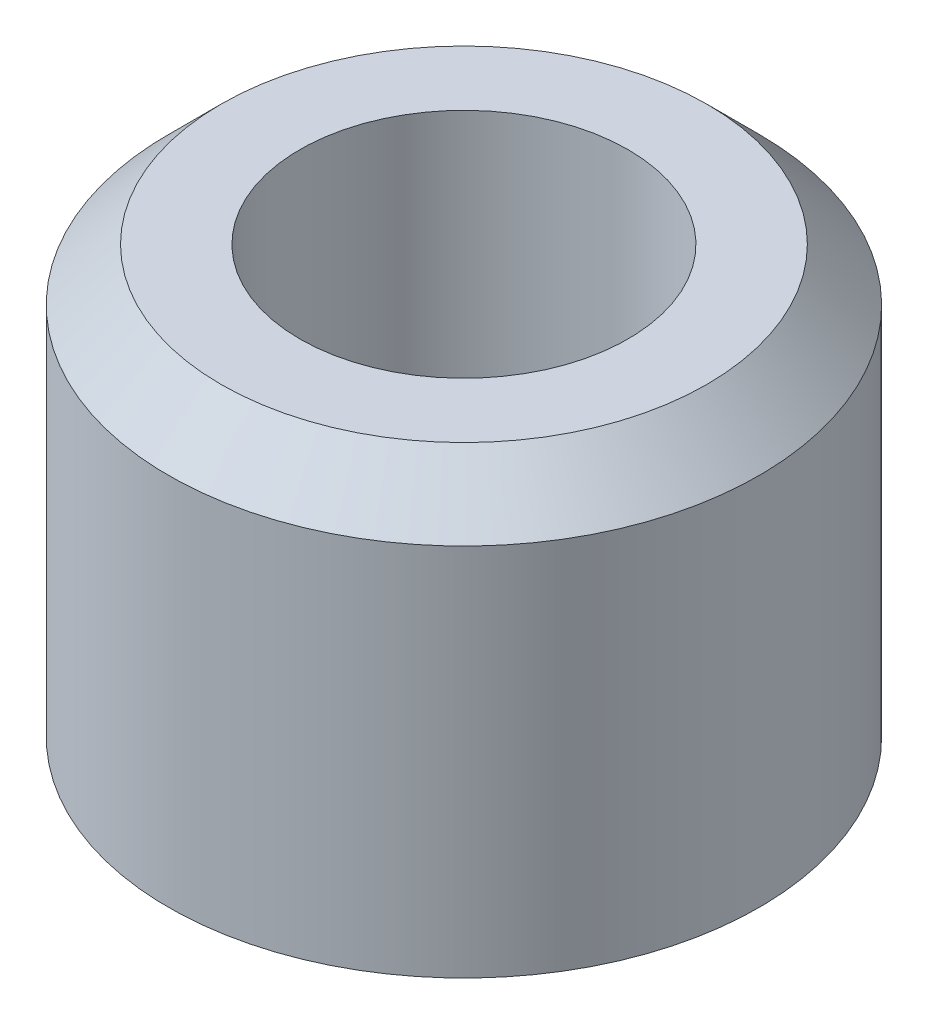
ISO-10303-21;
HEADER;
FILE_DESCRIPTION(('STEP AP214'),'2;1');
FILE_NAME('part.step','',(''),(''),'','','');
FILE_SCHEMA(('AUTOMOTIVE_DESIGN { 1 0 10303 214 1 1 1 1 }'));
ENDSEC;
DATA;
#1=APPLICATION_CONTEXT('core data for automotive mechanical design processes');
#2=APPLICATION_PROTOCOL_DEFINITION('international standard','automotive_design',2000,#1);
#3=PRODUCT_CONTEXT('',#1,'mechanical');
#4=PRODUCT('Part','Part','',(#3));
#5=PRODUCT_RELATED_PRODUCT_CATEGORY('part','',(#4));
#6=PRODUCT_DEFINITION_FORMATION('','',#4);
#7=PRODUCT_DEFINITION_CONTEXT('part definition',#1,'design');
#8=PRODUCT_DEFINITION('design','',#6,#7);
#9=PRODUCT_DEFINITION_SHAPE('','',#8);
#10=(LENGTH_UNIT() NAMED_UNIT(*) SI_UNIT(.MILLI.,.METRE.));
#11=(NAMED_UNIT(*) PLANE_ANGLE_UNIT() SI_UNIT($,.RADIAN.));
#12=(NAMED_UNIT(*) SI_UNIT($,.STERADIAN.) SOLID_ANGLE_UNIT());
#13=UNCERTAINTY_MEASURE_WITH_UNIT(LENGTH_MEASURE(1.E-05),#10,'distance_accuracy_value','');
#14=(GEOMETRIC_REPRESENTATION_CONTEXT(3) GLOBAL_UNCERTAINTY_ASSIGNED_CONTEXT((#13)) GLOBAL_UNIT_ASSIGNED_CONTEXT((#10,
#11,#12)) REPRESENTATION_CONTEXT('',''));
#15=CARTESIAN_POINT('',(0.,0.,0.));
#16=DIRECTION('',(0.,0.,1.));
#17=DIRECTION('',(1.,0.,0.));
#18=AXIS2_PLACEMENT_3D('',#15,#16,#17);
#19=CARTESIAN_POINT('',(0.,6.5,0.));
#20=DIRECTION('',(0.,1.,0.));
#21=DIRECTION('',(0.,0.,1.));
#22=AXIS2_PLACEMENT_3D('',#19,#20,#21);
#23=PLANE('',#22);
#24=CARTESIAN_POINT('',(0.,6.5,0.));
#25=DIRECTION('',(0.,1.,0.));
#26=DIRECTION('',(0.,0.,1.));
#27=AXIS2_PLACEMENT_3D('',#24,#25,#26);
#28=CIRCLE('',#27,3.70000000000001);
#29=CARTESIAN_POINT('',(0.,6.5,3.70000000000001));
#30=VERTEX_POINT('',#29);
#31=EDGE_CURVE('E40',#30,#30,#28,.T.);
#32=ORIENTED_EDGE('',*,*,#31,.T.);
#33=EDGE_LOOP('',(#32));
#34=FACE_BOUND('',#33,.T.);
#35=CARTESIAN_POINT('',(0.,6.5,0.));
#36=DIRECTION('',(0.,1.,0.));
#37=DIRECTION('',(0.,0.,1.));
#38=AXIS2_PLACEMENT_3D('',#35,#36,#37);
#39=CIRCLE('',#38,2.5);
#40=CARTESIAN_POINT('',(0.,6.5,-2.5));
#41=VERTEX_POINT('',#40);
#42=EDGE_CURVE('E48',#41,#41,#39,.T.);
#43=ORIENTED_EDGE('',*,*,#42,.F.);
#44=EDGE_LOOP('',(#43));
#45=FACE_BOUND('',#44,.T.);
#46=ADVANCED_FACE('F33',(#34,#45),#23,.T.);
#47=CARTESIAN_POINT('',(0.,0.,0.));
#48=DIRECTION('',(0.,1.,0.));
#49=DIRECTION('',(0.,0.,1.));
#50=AXIS2_PLACEMENT_3D('',#47,#48,#49);
#51=PLANE('',#50);
#52=CARTESIAN_POINT('',(0.,0.,0.));
#53=DIRECTION('',(0.,1.,0.));
#54=DIRECTION('',(0.,0.,1.));
#55=AXIS2_PLACEMENT_3D('',#52,#53,#54);
#56=CIRCLE('',#55,4.5);
#57=CARTESIAN_POINT('',(0.,0.,-4.5));
#58=VERTEX_POINT('',#57);
#59=EDGE_CURVE('E44',#58,#58,#56,.T.);
#60=ORIENTED_EDGE('',*,*,#59,.F.);
#61=EDGE_LOOP('',(#60));
#62=FACE_BOUND('',#61,.T.);
#63=CARTESIAN_POINT('',(0.,0.,0.));
#64=DIRECTION('',(0.,1.,0.));
#65=DIRECTION('',(0.,0.,1.));
#66=AXIS2_PLACEMENT_3D('',#63,#64,#65);
#67=CIRCLE('',#66,2.5);
#68=CARTESIAN_POINT('',(0.,0.,-2.5));
#69=VERTEX_POINT('',#68);
#70=EDGE_CURVE('E51',#69,#69,#67,.T.);
#71=ORIENTED_EDGE('',*,*,#70,.T.);
#72=EDGE_LOOP('',(#71));
#73=FACE_BOUND('',#72,.T.);
#74=ADVANCED_FACE('F61',(#62,#73),#51,.F.);
#75=CARTESIAN_POINT('',(0.,6.5,0.));
#76=DIRECTION('',(0.,-1.,0.));
#77=DIRECTION('',(0.,0.,-1.));
#78=AXIS2_PLACEMENT_3D('',#75,#76,#77);
#79=CYLINDRICAL_SURFACE('',#78,4.5);
#80=CARTESIAN_POINT('',(0.,5.70000000000001,0.));
#81=DIRECTION('',(0.,1.,0.));
#82=DIRECTION('',(0.,0.,1.));
#83=AXIS2_PLACEMENT_3D('',#80,#81,#82);
#84=CIRCLE('',#83,4.5);
#85=CARTESIAN_POINT('',(0.,5.70000000000001,-4.5));
#86=VERTEX_POINT('',#85);
#87=EDGE_CURVE('E10',#86,#86,#84,.F.);
#88=CARTESIAN_POINT('',(0.,5.70000000000001,-4.5));
#89=CARTESIAN_POINT('',(0.,5.64062500000001,-4.5));
#90=CARTESIAN_POINT('',(0.,5.58125000000001,-4.5));
#91=CARTESIAN_POINT('',(0.,5.46250000000001,-4.5));
#92=CARTESIAN_POINT('',(0.,5.40312500000001,-4.5));
#93=CARTESIAN_POINT('',(0.,5.28437500000001,-4.5));
#94=CARTESIAN_POINT('',(0.,5.22500000000001,-4.5));
#95=CARTESIAN_POINT('',(0.,5.10625000000001,-4.5));
#96=CARTESIAN_POINT('',(0.,5.04687500000001,-4.5));
#97=CARTESIAN_POINT('',(0.,4.928125,-4.5));
#98=CARTESIAN_POINT('',(0.,4.86875000000001,-4.5));
#99=CARTESIAN_POINT('',(0.,4.75000000000001,-4.5));
#100=CARTESIAN_POINT('',(0.,4.69062500000001,-4.5));
#101=CARTESIAN_POINT('',(0.,4.57187500000001,-4.5));
#102=CARTESIAN_POINT('',(0.,4.51250000000001,-4.5));
#103=CARTESIAN_POINT('',(0.,4.39375000000001,-4.5));
#104=CARTESIAN_POINT('',(0.,4.334375,-4.5));
#105=CARTESIAN_POINT('',(0.,4.215625,-4.5));
#106=CARTESIAN_POINT('',(0.,4.15625,-4.5));
#107=CARTESIAN_POINT('',(0.,4.0375,-4.5));
#108=CARTESIAN_POINT('',(0.,3.97812500000001,-4.5));
#109=CARTESIAN_POINT('',(0.,3.859375,-4.5));
#110=CARTESIAN_POINT('',(0.,3.8,-4.5));
#111=CARTESIAN_POINT('',(0.,3.68125,-4.5));
#112=CARTESIAN_POINT('',(0.,3.621875,-4.5));
#113=CARTESIAN_POINT('',(0.,3.503125,-4.5));
#114=CARTESIAN_POINT('',(0.,3.44375,-4.5));
#115=CARTESIAN_POINT('',(0.,3.325,-4.5));
#116=CARTESIAN_POINT('',(0.,3.265625,-4.5));
#117=CARTESIAN_POINT('',(0.,3.146875,-4.5));
#118=CARTESIAN_POINT('',(0.,3.0875,-4.5));
#119=CARTESIAN_POINT('',(0.,2.96875,-4.5));
#120=CARTESIAN_POINT('',(0.,2.909375,-4.5));
#121=CARTESIAN_POINT('',(0.,2.790625,-4.5));
#122=CARTESIAN_POINT('',(0.,2.73125,-4.5));
#123=CARTESIAN_POINT('',(0.,2.6125,-4.5));
#124=CARTESIAN_POINT('',(0.,2.553125,-4.5));
#125=CARTESIAN_POINT('',(0.,2.434375,-4.5));
#126=CARTESIAN_POINT('',(0.,2.375,-4.5));
#127=CARTESIAN_POINT('',(0.,2.25625,-4.5));
#128=CARTESIAN_POINT('',(0.,2.196875,-4.5));
#129=CARTESIAN_POINT('',(0.,2.078125,-4.5));
#130=CARTESIAN_POINT('',(0.,2.01875,-4.5));
#131=CARTESIAN_POINT('',(0.,1.9,-4.5));
#132=CARTESIAN_POINT('',(0.,1.840625,-4.5));
#133=CARTESIAN_POINT('',(0.,1.721875,-4.5));
#134=CARTESIAN_POINT('',(0.,1.6625,-4.5));
#135=CARTESIAN_POINT('',(0.,1.54375,-4.5));
#136=CARTESIAN_POINT('',(0.,1.484375,-4.5));
#137=CARTESIAN_POINT('',(0.,1.365625,-4.5));
#138=CARTESIAN_POINT('',(0.,1.30625,-4.5));
#139=CARTESIAN_POINT('',(0.,1.1875,-4.5));
#140=CARTESIAN_POINT('',(0.,1.128125,-4.5));
#141=CARTESIAN_POINT('',(0.,1.009375,-4.5));
#142=CARTESIAN_POINT('',(0.,0.950000000000001,-4.5));
#143=CARTESIAN_POINT('',(0.,0.831250000000001,-4.5));
#144=CARTESIAN_POINT('',(0.,0.771875000000001,-4.5));
#145=CARTESIAN_POINT('',(0.,0.653125000000001,-4.5));
#146=CARTESIAN_POINT('',(0.,0.593750000000001,-4.5));
#147=CARTESIAN_POINT('',(0.,0.475000000000001,-4.5));
#148=CARTESIAN_POINT('',(0.,0.415625000000001,-4.5));
#149=CARTESIAN_POINT('',(0.,0.296875000000001,-4.5));
#150=CARTESIAN_POINT('',(0.,0.2375,-4.5));
#151=CARTESIAN_POINT('',(0.,0.11875,-4.5));
#152=CARTESIAN_POINT('',(0.,0.0593750000000001,-4.5));
#153=CARTESIAN_POINT('',(0.,0.,-4.5));
#154=B_SPLINE_CURVE_WITH_KNOTS('',3,(#88,#89,#90,#91,#92,#93,#94,#95,#96,#97,#98,#99,#100,#101,
#102,#103,#104,#105,#106,#107,#108,#109,#110,#111,#112,#113,#114,#115,#116,#117,#118,#119,#120,
#121,#122,#123,#124,#125,#126,#127,#128,#129,#130,#131,#132,#133,#134,#135,#136,#137,#138,#139,
#140,#141,#142,#143,#144,#145,#146,#147,#148,#149,#150,#151,#152,#153),.UNSPECIFIED.,.F.,.F.,(4,
2,2,2,2,2,2,2,2,2,2,2,2,2,2,2,2,2,2,2,2,2,2,2,2,2,2,2,2,2,2,2,4),(0.,0.178124999999999,0.35625,
0.534375,0.7125,0.890625000000001,1.06875,1.246875,1.425,1.603125,1.78125,1.959375,2.1375,
2.315625,2.49375,2.671875,2.85,3.028125,3.20625,3.384375,3.5625,3.740625,3.91875,4.096875,4.275,
4.453125,4.63125,4.80937500000001,4.98750000000001,5.16562500000001,5.34375000000001,
5.52187500000001,5.70000000000001),.UNSPECIFIED.);
#155=EDGE_CURVE('BSEAM66',#86,#58,#154,.T.);
#156=ORIENTED_EDGE('',*,*,#87,.T.);
#157=ORIENTED_EDGE('',*,*,#59,.T.);
#158=ORIENTED_EDGE('',*,*,#155,.T.);
#159=ORIENTED_EDGE('',*,*,#155,.F.);
#160=EDGE_LOOP('',(#156,#158,#157,#159));
#161=FACE_BOUND('',#160,.T.);
#162=ADVANCED_FACE('F66',(#161),#79,.T.);
#163=CARTESIAN_POINT('',(0.,6.5,0.));
#164=DIRECTION('',(0.,-1.,0.));
#165=DIRECTION('',(0.,0.,-1.));
#166=AXIS2_PLACEMENT_3D('',#163,#164,#165);
#167=CYLINDRICAL_SURFACE('',#166,2.5);
#168=CARTESIAN_POINT('',(0.,6.5,-2.5));
#169=CARTESIAN_POINT('',(0.,6.43229166666667,-2.5));
#170=CARTESIAN_POINT('',(0.,6.36458333333333,-2.5));
#171=CARTESIAN_POINT('',(0.,6.22916666666667,-2.5));
#172=CARTESIAN_POINT('',(0.,6.16145833333333,-2.5));
#173=CARTESIAN_POINT('',(0.,6.02604166666667,-2.5));
#174=CARTESIAN_POINT('',(0.,5.95833333333333,-2.5));
#175=CARTESIAN_POINT('',(0.,5.82291666666667,-2.5));
#176=CARTESIAN_POINT('',(0.,5.75520833333333,-2.5));
#177=CARTESIAN_POINT('',(0.,5.61979166666667,-2.5));
#178=CARTESIAN_POINT('',(0.,5.55208333333333,-2.5));
#179=CARTESIAN_POINT('',(0.,5.41666666666667,-2.5));
#180=CARTESIAN_POINT('',(0.,5.34895833333333,-2.5));
#181=CARTESIAN_POINT('',(0.,5.21354166666667,-2.5));
#182=CARTESIAN_POINT('',(0.,5.14583333333333,-2.5));
#183=CARTESIAN_POINT('',(0.,5.01041666666667,-2.5));
#184=CARTESIAN_POINT('',(0.,4.94270833333333,-2.5));
#185=CARTESIAN_POINT('',(0.,4.80729166666667,-2.5));
#186=CARTESIAN_POINT('',(0.,4.73958333333333,-2.5));
#187=CARTESIAN_POINT('',(0.,4.60416666666667,-2.5));
#188=CARTESIAN_POINT('',(0.,4.53645833333333,-2.5));
#189=CARTESIAN_POINT('',(0.,4.40104166666667,-2.5));
#190=CARTESIAN_POINT('',(0.,4.33333333333333,-2.5));
#191=CARTESIAN_POINT('',(0.,4.19791666666667,-2.5));
#192=CARTESIAN_POINT('',(0.,4.13020833333333,-2.5));
#193=CARTESIAN_POINT('',(0.,3.99479166666667,-2.5));
#194=CARTESIAN_POINT('',(0.,3.92708333333333,-2.5));
#195=CARTESIAN_POINT('',(0.,3.79166666666667,-2.5));
#196=CARTESIAN_POINT('',(0.,3.72395833333333,-2.5));
#197=CARTESIAN_POINT('',(0.,3.58854166666667,-2.5));
#198=CARTESIAN_POINT('',(0.,3.52083333333333,-2.5));
#199=CARTESIAN_POINT('',(0.,3.38541666666667,-2.5));
#200=CARTESIAN_POINT('',(0.,3.31770833333333,-2.5));
#201=CARTESIAN_POINT('',(0.,3.18229166666667,-2.5));
#202=CARTESIAN_POINT('',(0.,3.11458333333333,-2.5));
#203=CARTESIAN_POINT('',(0.,2.97916666666667,-2.5));
#204=CARTESIAN_POINT('',(0.,2.91145833333333,-2.5));
#205=CARTESIAN_POINT('',(0.,2.77604166666667,-2.5));
#206=CARTESIAN_POINT('',(0.,2.70833333333333,-2.5));
#207=CARTESIAN_POINT('',(0.,2.57291666666667,-2.5));
#208=CARTESIAN_POINT('',(0.,2.50520833333333,-2.5));
#209=CARTESIAN_POINT('',(0.,2.36979166666667,-2.5));
#210=CARTESIAN_POINT('',(0.,2.30208333333333,-2.5));
#211=CARTESIAN_POINT('',(0.,2.16666666666667,-2.5));
#212=CARTESIAN_POINT('',(0.,2.09895833333333,-2.5));
#213=CARTESIAN_POINT('',(0.,1.96354166666667,-2.5));
#214=CARTESIAN_POINT('',(0.,1.89583333333333,-2.5));
#215=CARTESIAN_POINT('',(0.,1.76041666666667,-2.5));
#216=CARTESIAN_POINT('',(0.,1.69270833333333,-2.5));
#217=CARTESIAN_POINT('',(0.,1.55729166666667,-2.5));
#218=CARTESIAN_POINT('',(0.,1.48958333333333,-2.5));
#219=CARTESIAN_POINT('',(0.,1.35416666666667,-2.5));
#220=CARTESIAN_POINT('',(0.,1.28645833333333,-2.5));
#221=CARTESIAN_POINT('',(0.,1.15104166666667,-2.5));
#222=CARTESIAN_POINT('',(0.,1.08333333333333,-2.5));
#223=CARTESIAN_POINT('',(0.,0.947916666666667,-2.5));
#224=CARTESIAN_POINT('',(0.,0.880208333333333,-2.5));
#225=CARTESIAN_POINT('',(0.,0.744791666666667,-2.5));
#226=CARTESIAN_POINT('',(0.,0.677083333333333,-2.5));
#227=CARTESIAN_POINT('',(0.,0.541666666666667,-2.5));
#228=CARTESIAN_POINT('',(0.,0.473958333333333,-2.5));
#229=CARTESIAN_POINT('',(0.,0.338541666666667,-2.5));
#230=CARTESIAN_POINT('',(0.,0.270833333333334,-2.5));
#231=CARTESIAN_POINT('',(0.,0.135416666666667,-2.5));
#232=CARTESIAN_POINT('',(0.,0.0677083333333334,-2.5));
#233=CARTESIAN_POINT('',(0.,0.,-2.5));
#234=B_SPLINE_CURVE_WITH_KNOTS('',3,(#168,#169,#170,#171,#172,#173,#174,#175,#176,#177,#178,
#179,#180,#181,#182,#183,#184,#185,#186,#187,#188,#189,#190,#191,#192,#193,#194,#195,#196,#197,
#198,#199,#200,#201,#202,#203,#204,#205,#206,#207,#208,#209,#210,#211,#212,#213,#214,#215,#216,
#217,#218,#219,#220,#221,#222,#223,#224,#225,#226,#227,#228,#229,#230,#231,#232,#233),
.UNSPECIFIED.,.F.,.F.,(4,2,2,2,2,2,2,2,2,2,2,2,2,2,2,2,2,2,2,2,2,2,2,2,2,2,2,2,2,2,2,2,4),(0.,
0.203124999999999,0.40625,0.609375,0.812499999999999,1.015625,1.21875,1.421875,1.625,1.828125,
2.03125,2.234375,2.4375,2.640625,2.84375,3.046875,3.25,3.453125,3.65625,3.859375,4.0625,
4.265625,4.46875,4.671875,4.875,5.078125,5.28125,5.484375,5.6875,5.890625,6.09375,6.296875,6.5),.UNSPECIFIED.);
#235=EDGE_CURVE('BSEAM57',#41,#69,#234,.T.);
#236=ORIENTED_EDGE('',*,*,#42,.T.);
#237=ORIENTED_EDGE('',*,*,#70,.F.);
#238=ORIENTED_EDGE('',*,*,#235,.T.);
#239=ORIENTED_EDGE('',*,*,#235,.F.);
#240=EDGE_LOOP('',(#236,#238,#237,#239));
#241=FACE_BOUND('',#240,.T.);
#242=ADVANCED_FACE('F57',(#241),#167,.F.);
#243=CARTESIAN_POINT('',(0.,6.5,0.));
#244=DIRECTION('',(0.,-1.,0.));
#245=DIRECTION('',(0.,0.,-1.));
#246=AXIS2_PLACEMENT_3D('',#243,#244,#245);
#247=CONICAL_SURFACE('',#246,3.70000000000001,0.785398163397448);
#248=ORIENTED_EDGE('',*,*,#87,.F.);
#249=EDGE_LOOP('',(#248));
#250=FACE_BOUND('',#249,.T.);
#251=ORIENTED_EDGE('',*,*,#31,.F.);
#252=EDGE_LOOP('',(#251));
#253=FACE_BOUND('',#252,.T.);
#254=ADVANCED_FACE('F35',(#250,#253),#247,.T.);
#255=CLOSED_SHELL('',(#46,#74,#162,#242,#254));
#256=MANIFOLD_SOLID_BREP('B2',#255);
#257=ADVANCED_BREP_SHAPE_REPRESENTATION('',(#18,#256),#14);
#258=SHAPE_DEFINITION_REPRESENTATION(#9,#257);
ENDSEC;
END-ISO-10303-21;
